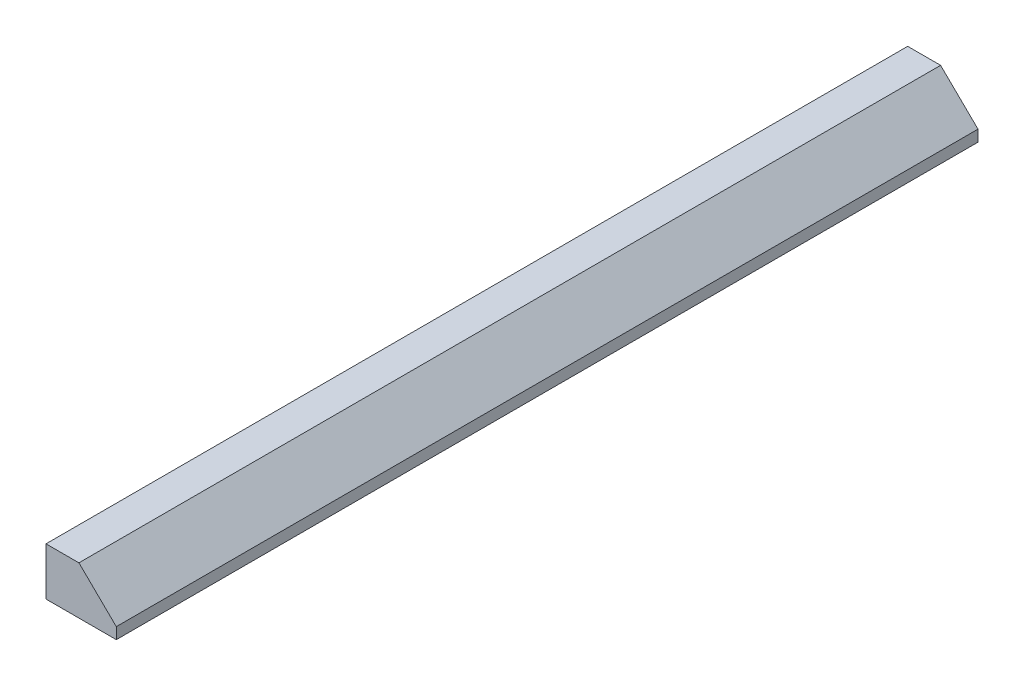
ISO-10303-21;
HEADER;
FILE_DESCRIPTION(('STEP AP214'),'2;1');
FILE_NAME('part.step','',(''),(''),'','','');
FILE_SCHEMA(('AUTOMOTIVE_DESIGN { 1 0 10303 214 1 1 1 1 }'));
ENDSEC;
DATA;
#1=APPLICATION_CONTEXT('core data for automotive mechanical design processes');
#2=APPLICATION_PROTOCOL_DEFINITION('international standard','automotive_design',2000,#1);
#3=PRODUCT_CONTEXT('',#1,'mechanical');
#4=PRODUCT('Part','Part','',(#3));
#5=PRODUCT_RELATED_PRODUCT_CATEGORY('part','',(#4));
#6=PRODUCT_DEFINITION_FORMATION('','',#4);
#7=PRODUCT_DEFINITION_CONTEXT('part definition',#1,'design');
#8=PRODUCT_DEFINITION('design','',#6,#7);
#9=PRODUCT_DEFINITION_SHAPE('','',#8);
#10=(LENGTH_UNIT() NAMED_UNIT(*) SI_UNIT(.MILLI.,.METRE.));
#11=(NAMED_UNIT(*) PLANE_ANGLE_UNIT() SI_UNIT($,.RADIAN.));
#12=(NAMED_UNIT(*) SI_UNIT($,.STERADIAN.) SOLID_ANGLE_UNIT());
#13=UNCERTAINTY_MEASURE_WITH_UNIT(LENGTH_MEASURE(1.E-05),#10,'distance_accuracy_value','');
#14=(GEOMETRIC_REPRESENTATION_CONTEXT(3) GLOBAL_UNCERTAINTY_ASSIGNED_CONTEXT((#13)) GLOBAL_UNIT_ASSIGNED_CONTEXT((#10,
#11,#12)) REPRESENTATION_CONTEXT('',''));
#15=CARTESIAN_POINT('',(0.,0.,0.));
#16=DIRECTION('',(0.,0.,1.));
#17=DIRECTION('',(1.,0.,0.));
#18=AXIS2_PLACEMENT_3D('',#15,#16,#17);
#19=CARTESIAN_POINT('',(-65.6166666666667,36.8652777777778,1828.8));
#20=DIRECTION('',(1.,0.,0.));
#21=DIRECTION('',(0.,0.,-1.));
#22=AXIS2_PLACEMENT_3D('',#19,#20,#21);
#23=PLANE('',#22);
#24=CARTESIAN_POINT('',(-65.6166666666667,-13.9347222222221,1059.18));
#25=DIRECTION('',(-1.,0.,0.));
#26=DIRECTION('',(0.,0.,-1.));
#27=AXIS2_PLACEMENT_3D('',#24,#25,#26);
#28=CIRCLE('',#27,8.57250000000001);
#29=CARTESIAN_POINT('',(-65.6166666666667,-13.9347222222221,1050.6075));
#30=VERTEX_POINT('',#29);
#31=EDGE_CURVE('E143',#30,#30,#28,.T.);
#32=ORIENTED_EDGE('',*,*,#31,.F.);
#33=EDGE_LOOP('',(#32));
#34=FACE_BOUND('',#33,.T.);
#35=CARTESIAN_POINT('',(-65.6166666666667,-13.9347222222221,769.62));
#36=DIRECTION('',(-1.,0.,0.));
#37=DIRECTION('',(0.,0.,1.));
#38=AXIS2_PLACEMENT_3D('',#35,#36,#37);
#39=CIRCLE('',#38,8.57249999999999);
#40=CARTESIAN_POINT('',(-65.6166666666667,-13.9347222222221,778.1925));
#41=VERTEX_POINT('',#40);
#42=EDGE_CURVE('E146',#41,#41,#39,.T.);
#43=ORIENTED_EDGE('',*,*,#42,.F.);
#44=EDGE_LOOP('',(#43));
#45=FACE_BOUND('',#44,.T.);
#46=DIRECTION('',(0.,-1.,0.));
#47=VECTOR('',#46,1.);
#48=CARTESIAN_POINT('',(-65.6166666666667,36.8652777777778,0.));
#49=LINE('',#48,#47);
#50=CARTESIAN_POINT('',(-65.6166666666667,36.8652777777778,0.));
#51=VERTEX_POINT('',#50);
#52=CARTESIAN_POINT('',(-65.6166666666667,-64.7347222222222,0.));
#53=VERTEX_POINT('',#52);
#54=EDGE_CURVE('E107',#51,#53,#49,.T.);
#55=ORIENTED_EDGE('',*,*,#54,.T.);
#56=DIRECTION('',(0.,0.,-1.));
#57=VECTOR('',#56,1.);
#58=CARTESIAN_POINT('',(-65.6166666666667,-64.7347222222222,1828.8));
#59=LINE('',#58,#57);
#60=CARTESIAN_POINT('',(-65.6166666666667,-64.7347222222222,1828.8));
#61=VERTEX_POINT('',#60);
#62=EDGE_CURVE('E11',#61,#53,#59,.T.);
#63=ORIENTED_EDGE('',*,*,#62,.F.);
#64=DIRECTION('',(0.,-1.,0.));
#65=VECTOR('',#64,1.);
#66=CARTESIAN_POINT('',(-65.6166666666667,36.8652777777778,1828.8));
#67=LINE('',#66,#65);
#68=CARTESIAN_POINT('',(-65.6166666666667,36.8652777777778,1828.8));
#69=VERTEX_POINT('',#68);
#70=EDGE_CURVE('E116',#69,#61,#67,.T.);
#71=ORIENTED_EDGE('',*,*,#70,.F.);
#72=DIRECTION('',(0.,0.,-1.));
#73=VECTOR('',#72,1.);
#74=CARTESIAN_POINT('',(-65.6166666666667,36.8652777777778,1828.8));
#75=LINE('',#74,#73);
#76=EDGE_CURVE('E103',#69,#51,#75,.T.);
#77=ORIENTED_EDGE('',*,*,#76,.T.);
#78=EDGE_LOOP('',(#55,#63,#71,#77));
#79=FACE_BOUND('',#78,.T.);
#80=ADVANCED_FACE('F33',(#34,#45,#79),#23,.F.);
#81=CARTESIAN_POINT('',(-65.6166666666667,-64.7347222222222,1828.8));
#82=DIRECTION('',(0.,1.,0.));
#83=DIRECTION('',(0.,0.,1.));
#84=AXIS2_PLACEMENT_3D('',#81,#82,#83);
#85=PLANE('',#84);
#86=DIRECTION('',(1.,0.,0.));
#87=VECTOR('',#86,1.);
#88=CARTESIAN_POINT('',(-65.6166666666667,-64.7347222222222,0.));
#89=LINE('',#88,#87);
#90=CARTESIAN_POINT('',(83.6083333333333,-64.7347222222222,0.));
#91=VERTEX_POINT('',#90);
#92=EDGE_CURVE('E110',#53,#91,#89,.T.);
#93=ORIENTED_EDGE('',*,*,#92,.T.);
#94=DIRECTION('',(0.,0.,-1.));
#95=VECTOR('',#94,1.);
#96=CARTESIAN_POINT('',(83.6083333333333,-64.7347222222222,1828.8));
#97=LINE('',#96,#95);
#98=CARTESIAN_POINT('',(83.6083333333333,-64.7347222222222,1828.8));
#99=VERTEX_POINT('',#98);
#100=EDGE_CURVE('E41',#99,#91,#97,.T.);
#101=ORIENTED_EDGE('',*,*,#100,.F.);
#102=DIRECTION('',(1.,0.,0.));
#103=VECTOR('',#102,1.);
#104=CARTESIAN_POINT('',(-65.6166666666667,-64.7347222222222,1828.8));
#105=LINE('',#104,#103);
#106=EDGE_CURVE('E83',#61,#99,#105,.T.);
#107=ORIENTED_EDGE('',*,*,#106,.F.);
#108=ORIENTED_EDGE('',*,*,#62,.T.);
#109=EDGE_LOOP('',(#93,#101,#107,#108));
#110=FACE_BOUND('',#109,.T.);
#111=ADVANCED_FACE('F135',(#110),#85,.F.);
#112=CARTESIAN_POINT('',(83.6083333333333,-40.7458333333333,1828.8));
#113=DIRECTION('',(-1.,0.,0.));
#114=DIRECTION('',(0.,0.,1.));
#115=AXIS2_PLACEMENT_3D('',#112,#113,#114);
#116=PLANE('',#115);
#117=DIRECTION('',(0.,1.,0.));
#118=VECTOR('',#117,1.);
#119=CARTESIAN_POINT('',(83.6083333333333,-40.7458333333333,0.));
#120=LINE('',#119,#118);
#121=CARTESIAN_POINT('',(83.6083333333333,-40.7458333333333,0.));
#122=VERTEX_POINT('',#121);
#123=EDGE_CURVE('E98',#91,#122,#120,.T.);
#124=ORIENTED_EDGE('',*,*,#123,.T.);
#125=DIRECTION('',(0.,0.,-1.));
#126=VECTOR('',#125,1.);
#127=CARTESIAN_POINT('',(83.6083333333333,-40.7458333333333,1828.8));
#128=LINE('',#127,#126);
#129=CARTESIAN_POINT('',(83.6083333333333,-40.7458333333333,1828.8));
#130=VERTEX_POINT('',#129);
#131=EDGE_CURVE('E95',#130,#122,#128,.T.);
#132=ORIENTED_EDGE('',*,*,#131,.F.);
#133=DIRECTION('',(0.,1.,0.));
#134=VECTOR('',#133,1.);
#135=CARTESIAN_POINT('',(83.6083333333333,-40.7458333333333,1828.8));
#136=LINE('',#135,#134);
#137=EDGE_CURVE('E87',#99,#130,#136,.T.);
#138=ORIENTED_EDGE('',*,*,#137,.F.);
#139=ORIENTED_EDGE('',*,*,#100,.T.);
#140=EDGE_LOOP('',(#124,#132,#138,#139));
#141=FACE_BOUND('',#140,.T.);
#142=ADVANCED_FACE('F96',(#141),#116,.F.);
#143=CARTESIAN_POINT('',(4.23333333333328,36.8652777777778,1828.8));
#144=DIRECTION('',(-0.699117631923878,-0.715006669013058,0.));
#145=DIRECTION('',(0.715006669013058,-0.699117631923878,0.));
#146=AXIS2_PLACEMENT_3D('',#143,#144,#145);
#147=PLANE('',#146);
#148=DIRECTION('',(-0.715006669013058,0.699117631923878,0.));
#149=VECTOR('',#148,1.);
#150=CARTESIAN_POINT('',(4.23333333333328,36.8652777777778,0.));
#151=LINE('',#150,#149);
#152=CARTESIAN_POINT('',(4.23333333333328,36.8652777777778,0.));
#153=VERTEX_POINT('',#152);
#154=EDGE_CURVE('E69',#122,#153,#151,.T.);
#155=ORIENTED_EDGE('',*,*,#154,.T.);
#156=DIRECTION('',(0.,0.,-1.));
#157=VECTOR('',#156,1.);
#158=CARTESIAN_POINT('',(4.23333333333328,36.8652777777778,1828.8));
#159=LINE('',#158,#157);
#160=CARTESIAN_POINT('',(4.23333333333328,36.8652777777778,1828.8));
#161=VERTEX_POINT('',#160);
#162=EDGE_CURVE('E99',#161,#153,#159,.T.);
#163=ORIENTED_EDGE('',*,*,#162,.F.);
#164=DIRECTION('',(-0.715006669013058,0.699117631923878,0.));
#165=VECTOR('',#164,1.);
#166=CARTESIAN_POINT('',(4.23333333333328,36.8652777777778,1828.8));
#167=LINE('',#166,#165);
#168=EDGE_CURVE('E91',#130,#161,#167,.T.);
#169=ORIENTED_EDGE('',*,*,#168,.F.);
#170=ORIENTED_EDGE('',*,*,#131,.T.);
#171=EDGE_LOOP('',(#155,#163,#169,#170));
#172=FACE_BOUND('',#171,.T.);
#173=ADVANCED_FACE('F101',(#172),#147,.F.);
#174=CARTESIAN_POINT('',(-65.6166666666667,36.8652777777778,1828.8));
#175=DIRECTION('',(0.,-1.,0.));
#176=DIRECTION('',(1.,0.,0.));
#177=AXIS2_PLACEMENT_3D('',#174,#175,#176);
#178=PLANE('',#177);
#179=DIRECTION('',(-1.,0.,0.));
#180=VECTOR('',#179,1.);
#181=CARTESIAN_POINT('',(-65.6166666666667,36.8652777777778,0.));
#182=LINE('',#181,#180);
#183=EDGE_CURVE('E75',#153,#51,#182,.T.);
#184=ORIENTED_EDGE('',*,*,#183,.T.);
#185=ORIENTED_EDGE('',*,*,#76,.F.);
#186=DIRECTION('',(-1.,0.,0.));
#187=VECTOR('',#186,1.);
#188=CARTESIAN_POINT('',(-65.6166666666667,36.8652777777778,1828.8));
#189=LINE('',#188,#187);
#190=EDGE_CURVE('E49',#161,#69,#189,.T.);
#191=ORIENTED_EDGE('',*,*,#190,.F.);
#192=ORIENTED_EDGE('',*,*,#162,.T.);
#193=EDGE_LOOP('',(#184,#185,#191,#192));
#194=FACE_BOUND('',#193,.T.);
#195=ADVANCED_FACE('F124',(#194),#178,.F.);
#196=CARTESIAN_POINT('',(0.,0.,1828.8));
#197=DIRECTION('',(0.,0.,1.));
#198=DIRECTION('',(1.,0.,0.));
#199=AXIS2_PLACEMENT_3D('',#196,#197,#198);
#200=PLANE('',#199);
#201=ORIENTED_EDGE('',*,*,#70,.T.);
#202=ORIENTED_EDGE('',*,*,#106,.T.);
#203=ORIENTED_EDGE('',*,*,#137,.T.);
#204=ORIENTED_EDGE('',*,*,#168,.T.);
#205=ORIENTED_EDGE('',*,*,#190,.T.);
#206=EDGE_LOOP('',(#201,#202,#203,#204,#205));
#207=FACE_BOUND('',#206,.T.);
#208=ADVANCED_FACE('F89',(#207),#200,.T.);
#209=CARTESIAN_POINT('',(0.,0.,0.));
#210=DIRECTION('',(0.,0.,1.));
#211=DIRECTION('',(1.,0.,0.));
#212=AXIS2_PLACEMENT_3D('',#209,#210,#211);
#213=PLANE('',#212);
#214=ORIENTED_EDGE('',*,*,#54,.F.);
#215=ORIENTED_EDGE('',*,*,#183,.F.);
#216=ORIENTED_EDGE('',*,*,#154,.F.);
#217=ORIENTED_EDGE('',*,*,#123,.F.);
#218=ORIENTED_EDGE('',*,*,#92,.F.);
#219=EDGE_LOOP('',(#214,#215,#216,#217,#218));
#220=FACE_BOUND('',#219,.T.);
#221=ADVANCED_FACE('F120',(#220),#213,.F.);
#222=CARTESIAN_POINT('',(-2.11666666666666,-13.9347222222221,769.62));
#223=DIRECTION('',(-1.,0.,0.));
#224=DIRECTION('',(0.,0.,1.));
#225=AXIS2_PLACEMENT_3D('',#222,#223,#224);
#226=CYLINDRICAL_SURFACE('',#225,8.57249999999999);
#227=CARTESIAN_POINT('',(-2.11666666666666,-13.9347222222221,769.62));
#228=DIRECTION('',(-1.,0.,0.));
#229=DIRECTION('',(0.,0.,1.));
#230=AXIS2_PLACEMENT_3D('',#227,#228,#229);
#231=CIRCLE('',#230,8.57249999999999);
#232=CARTESIAN_POINT('',(-2.11666666666666,-13.9347222222221,778.1925));
#233=VERTEX_POINT('',#232);
#234=EDGE_CURVE('E111',#233,#233,#231,.T.);
#235=ORIENTED_EDGE('',*,*,#234,.F.);
#236=EDGE_LOOP('',(#235));
#237=FACE_BOUND('',#236,.T.);
#238=ORIENTED_EDGE('',*,*,#42,.T.);
#239=EDGE_LOOP('',(#238));
#240=FACE_BOUND('',#239,.T.);
#241=ADVANCED_FACE('F169',(#237,#240),#226,.F.);
#242=CARTESIAN_POINT('',(-2.11666666666666,-13.9347222222221,769.62));
#243=DIRECTION('',(-1.,0.,0.));
#244=DIRECTION('',(0.,0.,1.));
#245=AXIS2_PLACEMENT_3D('',#242,#243,#244);
#246=PLANE('',#245);
#247=ORIENTED_EDGE('',*,*,#234,.T.);
#248=EDGE_LOOP('',(#247));
#249=FACE_BOUND('',#248,.T.);
#250=ADVANCED_FACE('F160',(#249),#246,.T.);
#251=CARTESIAN_POINT('',(-2.11666666666666,-13.9347222222221,1059.18));
#252=DIRECTION('',(-1.,0.,0.));
#253=DIRECTION('',(0.,0.,1.));
#254=AXIS2_PLACEMENT_3D('',#251,#252,#253);
#255=CYLINDRICAL_SURFACE('',#254,8.57250000000001);
#256=CARTESIAN_POINT('',(-2.11666666666666,-13.9347222222221,1059.18));
#257=DIRECTION('',(-1.,0.,0.));
#258=DIRECTION('',(0.,0.,-1.));
#259=AXIS2_PLACEMENT_3D('',#256,#257,#258);
#260=CIRCLE('',#259,8.57250000000001);
#261=CARTESIAN_POINT('',(-2.11666666666666,-13.9347222222221,1050.6075));
#262=VERTEX_POINT('',#261);
#263=EDGE_CURVE('E148',#262,#262,#260,.T.);
#264=ORIENTED_EDGE('',*,*,#263,.F.);
#265=EDGE_LOOP('',(#264));
#266=FACE_BOUND('',#265,.T.);
#267=ORIENTED_EDGE('',*,*,#31,.T.);
#268=EDGE_LOOP('',(#267));
#269=FACE_BOUND('',#268,.T.);
#270=ADVANCED_FACE('F157',(#266,#269),#255,.F.);
#271=CARTESIAN_POINT('',(-2.11666666666666,-13.9347222222221,1059.18));
#272=DIRECTION('',(1.,0.,0.));
#273=DIRECTION('',(0.,0.,-1.));
#274=AXIS2_PLACEMENT_3D('',#271,#272,#273);
#275=PLANE('',#274);
#276=ORIENTED_EDGE('',*,*,#263,.T.);
#277=EDGE_LOOP('',(#276));
#278=FACE_BOUND('',#277,.T.);
#279=ADVANCED_FACE('F159',(#278),#275,.F.);
#280=CLOSED_SHELL('',(#80,#111,#142,#173,#195,#208,#221,#241,#250,#270,#279));
#281=MANIFOLD_SOLID_BREP('B2',#280);
#282=ADVANCED_BREP_SHAPE_REPRESENTATION('',(#18,#281),#14);
#283=SHAPE_DEFINITION_REPRESENTATION(#9,#282);
ENDSEC;
END-ISO-10303-21;
